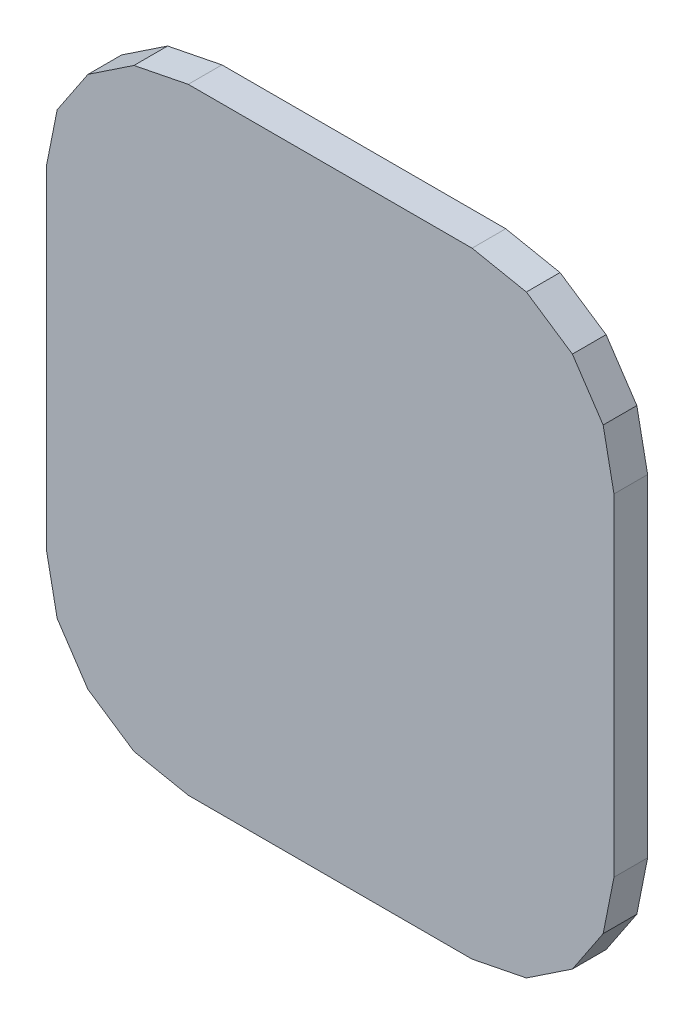
ISO-10303-21;
HEADER;
FILE_DESCRIPTION(('STEP AP214'),'2;1');
FILE_NAME('part.step','',(''),(''),'','','');
FILE_SCHEMA(('AUTOMOTIVE_DESIGN { 1 0 10303 214 1 1 1 1 }'));
ENDSEC;
DATA;
#1=APPLICATION_CONTEXT('core data for automotive mechanical design processes');
#2=APPLICATION_PROTOCOL_DEFINITION('international standard','automotive_design',2000,#1);
#3=PRODUCT_CONTEXT('',#1,'mechanical');
#4=PRODUCT('Part','Part','',(#3));
#5=PRODUCT_RELATED_PRODUCT_CATEGORY('part','',(#4));
#6=PRODUCT_DEFINITION_FORMATION('','',#4);
#7=PRODUCT_DEFINITION_CONTEXT('part definition',#1,'design');
#8=PRODUCT_DEFINITION('design','',#6,#7);
#9=PRODUCT_DEFINITION_SHAPE('','',#8);
#10=(LENGTH_UNIT() NAMED_UNIT(*) SI_UNIT(.MILLI.,.METRE.));
#11=(NAMED_UNIT(*) PLANE_ANGLE_UNIT() SI_UNIT($,.RADIAN.));
#12=(NAMED_UNIT(*) SI_UNIT($,.STERADIAN.) SOLID_ANGLE_UNIT());
#13=UNCERTAINTY_MEASURE_WITH_UNIT(LENGTH_MEASURE(1.E-05),#10,'distance_accuracy_value','');
#14=(GEOMETRIC_REPRESENTATION_CONTEXT(3) GLOBAL_UNCERTAINTY_ASSIGNED_CONTEXT((#13)) GLOBAL_UNIT_ASSIGNED_CONTEXT((#10,
#11,#12)) REPRESENTATION_CONTEXT('',''));
#15=CARTESIAN_POINT('',(0.,0.,0.));
#16=DIRECTION('',(0.,0.,1.));
#17=DIRECTION('',(1.,0.,0.));
#18=AXIS2_PLACEMENT_3D('',#15,#16,#17);
#19=CARTESIAN_POINT('',(97.865,-121.8,1.635));
#20=DIRECTION('',(0.,0.,-1.));
#21=DIRECTION('',(0.,-1.,0.));
#22=AXIS2_PLACEMENT_3D('',#19,#20,#21);
#23=PLANE('',#22);
#24=DIRECTION('',(0.980784640360412,-0.195093539701082,0.));
#25=VECTOR('',#24,1.);
#26=CARTESIAN_POINT('',(98.0125,-121.48,1.635));
#27=LINE('',#26,#25);
#28=CARTESIAN_POINT('',(98.0125,-121.48,1.635));
#29=VERTEX_POINT('',#28);
#30=CARTESIAN_POINT('',(98.068946,-121.491228,1.635));
#31=VERTEX_POINT('',#30);
#32=EDGE_CURVE('E25',#29,#31,#27,.T.);
#33=ORIENTED_EDGE('',*,*,#32,.F.);
#34=DIRECTION('',(1.,0.,0.));
#35=VECTOR('',#34,1.);
#36=CARTESIAN_POINT('',(97.7175,-121.48,1.635));
#37=LINE('',#36,#35);
#38=CARTESIAN_POINT('',(97.7175,-121.48,1.635));
#39=VERTEX_POINT('',#38);
#40=EDGE_CURVE('E413',#39,#29,#37,.T.);
#41=ORIENTED_EDGE('',*,*,#40,.F.);
#42=DIRECTION('',(0.980784640360412,0.195093539701082,0.));
#43=VECTOR('',#42,1.);
#44=CARTESIAN_POINT('',(97.661054,-121.491228,1.635));
#45=LINE('',#44,#43);
#46=CARTESIAN_POINT('',(97.661054,-121.491228,1.635));
#47=VERTEX_POINT('',#46);
#48=EDGE_CURVE('E290',#47,#39,#45,.T.);
#49=ORIENTED_EDGE('',*,*,#48,.F.);
#50=DIRECTION('',(0.831467077354216,0.555574026819144,0.));
#51=VECTOR('',#50,1.);
#52=CARTESIAN_POINT('',(97.613202,-121.523202,1.635));
#53=LINE('',#52,#51);
#54=CARTESIAN_POINT('',(97.613202,-121.523202,1.635));
#55=VERTEX_POINT('',#54);
#56=EDGE_CURVE('E291',#55,#47,#53,.T.);
#57=ORIENTED_EDGE('',*,*,#56,.F.);
#58=DIRECTION('',(0.555574026819144,0.831467077354216,0.));
#59=VECTOR('',#58,1.);
#60=CARTESIAN_POINT('',(97.581228,-121.571054,1.635));
#61=LINE('',#60,#59);
#62=CARTESIAN_POINT('',(97.581228,-121.571054,1.635));
#63=VERTEX_POINT('',#62);
#64=EDGE_CURVE('E319',#63,#55,#61,.T.);
#65=ORIENTED_EDGE('',*,*,#64,.F.);
#66=DIRECTION('',(0.195093539701082,0.980784640360412,0.));
#67=VECTOR('',#66,1.);
#68=CARTESIAN_POINT('',(97.57,-121.6275,1.635));
#69=LINE('',#68,#67);
#70=CARTESIAN_POINT('',(97.57,-121.6275,1.635));
#71=VERTEX_POINT('',#70);
#72=EDGE_CURVE('E241',#71,#63,#69,.T.);
#73=ORIENTED_EDGE('',*,*,#72,.F.);
#74=DIRECTION('',(0.,1.,0.));
#75=VECTOR('',#74,1.);
#76=CARTESIAN_POINT('',(97.57,-121.9725,1.635));
#77=LINE('',#76,#75);
#78=CARTESIAN_POINT('',(97.57,-121.9725,1.635));
#79=VERTEX_POINT('',#78);
#80=EDGE_CURVE('E277',#79,#71,#77,.T.);
#81=ORIENTED_EDGE('',*,*,#80,.F.);
#82=DIRECTION('',(-0.195093539701082,0.980784640360412,0.));
#83=VECTOR('',#82,1.);
#84=CARTESIAN_POINT('',(97.581228,-122.028946,1.635));
#85=LINE('',#84,#83);
#86=CARTESIAN_POINT('',(97.581228,-122.028946,1.635));
#87=VERTEX_POINT('',#86);
#88=EDGE_CURVE('E384',#87,#79,#85,.T.);
#89=ORIENTED_EDGE('',*,*,#88,.F.);
#90=DIRECTION('',(-0.555574026819144,0.831467077354216,0.));
#91=VECTOR('',#90,1.);
#92=CARTESIAN_POINT('',(97.613202,-122.076798,1.635));
#93=LINE('',#92,#91);
#94=CARTESIAN_POINT('',(97.613202,-122.076798,1.635));
#95=VERTEX_POINT('',#94);
#96=EDGE_CURVE('E271',#95,#87,#93,.T.);
#97=ORIENTED_EDGE('',*,*,#96,.F.);
#98=DIRECTION('',(-0.831467077354216,0.555574026819144,0.));
#99=VECTOR('',#98,1.);
#100=CARTESIAN_POINT('',(97.661054,-122.108772,1.635));
#101=LINE('',#100,#99);
#102=CARTESIAN_POINT('',(97.661054,-122.108772,1.635));
#103=VERTEX_POINT('',#102);
#104=EDGE_CURVE('E370',#103,#95,#101,.T.);
#105=ORIENTED_EDGE('',*,*,#104,.F.);
#106=DIRECTION('',(-0.980784640360412,0.195093539701082,0.));
#107=VECTOR('',#106,1.);
#108=CARTESIAN_POINT('',(97.7175,-122.12,1.635));
#109=LINE('',#108,#107);
#110=CARTESIAN_POINT('',(97.7175,-122.12,1.635));
#111=VERTEX_POINT('',#110);
#112=EDGE_CURVE('E354',#111,#103,#109,.T.);
#113=ORIENTED_EDGE('',*,*,#112,.F.);
#114=DIRECTION('',(-1.,0.,0.));
#115=VECTOR('',#114,1.);
#116=CARTESIAN_POINT('',(98.0125,-122.12,1.635));
#117=LINE('',#116,#115);
#118=CARTESIAN_POINT('',(98.0125,-122.12,1.635));
#119=VERTEX_POINT('',#118);
#120=EDGE_CURVE('E345',#119,#111,#117,.T.);
#121=ORIENTED_EDGE('',*,*,#120,.F.);
#122=DIRECTION('',(-0.980784640360412,-0.195093539701082,0.));
#123=VECTOR('',#122,1.);
#124=CARTESIAN_POINT('',(98.068946,-122.108772,1.635));
#125=LINE('',#124,#123);
#126=CARTESIAN_POINT('',(98.068946,-122.108772,1.635));
#127=VERTEX_POINT('',#126);
#128=EDGE_CURVE('E247',#127,#119,#125,.T.);
#129=ORIENTED_EDGE('',*,*,#128,.F.);
#130=DIRECTION('',(-0.831467077354216,-0.555574026819144,0.));
#131=VECTOR('',#130,1.);
#132=CARTESIAN_POINT('',(98.116798,-122.076798,1.635));
#133=LINE('',#132,#131);
#134=CARTESIAN_POINT('',(98.116798,-122.076798,1.635));
#135=VERTEX_POINT('',#134);
#136=EDGE_CURVE('E318',#135,#127,#133,.T.);
#137=ORIENTED_EDGE('',*,*,#136,.F.);
#138=DIRECTION('',(-0.555574026819144,-0.831467077354216,0.));
#139=VECTOR('',#138,1.);
#140=CARTESIAN_POINT('',(98.148772,-122.028946,1.635));
#141=LINE('',#140,#139);
#142=CARTESIAN_POINT('',(98.148772,-122.028946,1.635));
#143=VERTEX_POINT('',#142);
#144=EDGE_CURVE('E300',#143,#135,#141,.T.);
#145=ORIENTED_EDGE('',*,*,#144,.F.);
#146=DIRECTION('',(-0.195093539701082,-0.980784640360412,0.));
#147=VECTOR('',#146,1.);
#148=CARTESIAN_POINT('',(98.16,-121.9725,1.635));
#149=LINE('',#148,#147);
#150=CARTESIAN_POINT('',(98.16,-121.9725,1.635));
#151=VERTEX_POINT('',#150);
#152=EDGE_CURVE('E264',#151,#143,#149,.T.);
#153=ORIENTED_EDGE('',*,*,#152,.F.);
#154=DIRECTION('',(0.,-1.,0.));
#155=VECTOR('',#154,1.);
#156=CARTESIAN_POINT('',(98.16,-121.6275,1.635));
#157=LINE('',#156,#155);
#158=CARTESIAN_POINT('',(98.16,-121.6275,1.635));
#159=VERTEX_POINT('',#158);
#160=EDGE_CURVE('E210',#159,#151,#157,.T.);
#161=ORIENTED_EDGE('',*,*,#160,.F.);
#162=DIRECTION('',(0.195093539701082,-0.980784640360412,0.));
#163=VECTOR('',#162,1.);
#164=CARTESIAN_POINT('',(98.148772,-121.571054,1.635));
#165=LINE('',#164,#163);
#166=CARTESIAN_POINT('',(98.148772,-121.571054,1.635));
#167=VERTEX_POINT('',#166);
#168=EDGE_CURVE('E221',#167,#159,#165,.T.);
#169=ORIENTED_EDGE('',*,*,#168,.F.);
#170=DIRECTION('',(0.555574026818682,-0.831467077354524,0.));
#171=VECTOR('',#170,1.);
#172=CARTESIAN_POINT('',(98.116798,-121.523202,1.635));
#173=LINE('',#172,#171);
#174=CARTESIAN_POINT('',(98.116798,-121.523202,1.635));
#175=VERTEX_POINT('',#174);
#176=EDGE_CURVE('E224',#175,#167,#173,.T.);
#177=ORIENTED_EDGE('',*,*,#176,.F.);
#178=DIRECTION('',(0.831467077354524,-0.555574026818682,0.));
#179=VECTOR('',#178,1.);
#180=CARTESIAN_POINT('',(98.068946,-121.491228,1.635));
#181=LINE('',#180,#179);
#182=EDGE_CURVE('E471',#31,#175,#181,.T.);
#183=ORIENTED_EDGE('',*,*,#182,.F.);
#184=EDGE_LOOP('',(#33,#41,#49,#57,#65,#73,#81,#89,#97,#105,#113,#121,#129,#137,#145,#153,#161,
#169,#177,#183));
#185=FACE_BOUND('',#184,.T.);
#186=ADVANCED_FACE('F17',(#185),#23,.F.);
#187=CARTESIAN_POINT('',(97.865,-121.8,1.6));
#188=DIRECTION('',(0.,0.,-1.));
#189=DIRECTION('',(0.,-1.,0.));
#190=AXIS2_PLACEMENT_3D('',#187,#188,#189);
#191=PLANE('',#190);
#192=DIRECTION('',(0.831467077354524,-0.555574026818682,0.));
#193=VECTOR('',#192,1.);
#194=CARTESIAN_POINT('',(98.068946,-121.491228,1.6));
#195=LINE('',#194,#193);
#196=CARTESIAN_POINT('',(98.068946,-121.491228,1.6));
#197=VERTEX_POINT('',#196);
#198=CARTESIAN_POINT('',(98.116798,-121.523202,1.6));
#199=VERTEX_POINT('',#198);
#200=EDGE_CURVE('E216',#197,#199,#195,.T.);
#201=ORIENTED_EDGE('',*,*,#200,.T.);
#202=DIRECTION('',(0.555574026818682,-0.831467077354524,0.));
#203=VECTOR('',#202,1.);
#204=CARTESIAN_POINT('',(98.116798,-121.523202,1.6));
#205=LINE('',#204,#203);
#206=CARTESIAN_POINT('',(98.148772,-121.571054,1.6));
#207=VERTEX_POINT('',#206);
#208=EDGE_CURVE('E213',#199,#207,#205,.T.);
#209=ORIENTED_EDGE('',*,*,#208,.T.);
#210=DIRECTION('',(0.195093539701082,-0.980784640360412,0.));
#211=VECTOR('',#210,1.);
#212=CARTESIAN_POINT('',(98.148772,-121.571054,1.6));
#213=LINE('',#212,#211);
#214=CARTESIAN_POINT('',(98.16,-121.6275,1.6));
#215=VERTEX_POINT('',#214);
#216=EDGE_CURVE('E198',#207,#215,#213,.T.);
#217=ORIENTED_EDGE('',*,*,#216,.T.);
#218=DIRECTION('',(0.,-1.,0.));
#219=VECTOR('',#218,1.);
#220=CARTESIAN_POINT('',(98.16,-121.6275,1.6));
#221=LINE('',#220,#219);
#222=CARTESIAN_POINT('',(98.16,-121.9725,1.6));
#223=VERTEX_POINT('',#222);
#224=EDGE_CURVE('E255',#215,#223,#221,.T.);
#225=ORIENTED_EDGE('',*,*,#224,.T.);
#226=DIRECTION('',(-0.195093539701082,-0.980784640360412,0.));
#227=VECTOR('',#226,1.);
#228=CARTESIAN_POINT('',(98.16,-121.9725,1.6));
#229=LINE('',#228,#227);
#230=CARTESIAN_POINT('',(98.148772,-122.028946,1.6));
#231=VERTEX_POINT('',#230);
#232=EDGE_CURVE('E263',#223,#231,#229,.T.);
#233=ORIENTED_EDGE('',*,*,#232,.T.);
#234=DIRECTION('',(-0.555574026819144,-0.831467077354216,0.));
#235=VECTOR('',#234,1.);
#236=CARTESIAN_POINT('',(98.148772,-122.028946,1.6));
#237=LINE('',#236,#235);
#238=CARTESIAN_POINT('',(98.116798,-122.076798,1.6));
#239=VERTEX_POINT('',#238);
#240=EDGE_CURVE('E311',#231,#239,#237,.T.);
#241=ORIENTED_EDGE('',*,*,#240,.T.);
#242=DIRECTION('',(-0.831467077354216,-0.555574026819144,0.));
#243=VECTOR('',#242,1.);
#244=CARTESIAN_POINT('',(98.116798,-122.076798,1.6));
#245=LINE('',#244,#243);
#246=CARTESIAN_POINT('',(98.068946,-122.108772,1.6));
#247=VERTEX_POINT('',#246);
#248=EDGE_CURVE('E234',#239,#247,#245,.T.);
#249=ORIENTED_EDGE('',*,*,#248,.T.);
#250=DIRECTION('',(-0.980784640360412,-0.195093539701082,0.));
#251=VECTOR('',#250,1.);
#252=CARTESIAN_POINT('',(98.068946,-122.108772,1.6));
#253=LINE('',#252,#251);
#254=CARTESIAN_POINT('',(98.0125,-122.12,1.6));
#255=VERTEX_POINT('',#254);
#256=EDGE_CURVE('E341',#247,#255,#253,.T.);
#257=ORIENTED_EDGE('',*,*,#256,.T.);
#258=DIRECTION('',(-1.,0.,0.));
#259=VECTOR('',#258,1.);
#260=CARTESIAN_POINT('',(98.0125,-122.12,1.6));
#261=LINE('',#260,#259);
#262=CARTESIAN_POINT('',(97.7175,-122.12,1.6));
#263=VERTEX_POINT('',#262);
#264=EDGE_CURVE('E353',#255,#263,#261,.T.);
#265=ORIENTED_EDGE('',*,*,#264,.T.);
#266=DIRECTION('',(-0.980784640360412,0.195093539701082,0.));
#267=VECTOR('',#266,1.);
#268=CARTESIAN_POINT('',(97.7175,-122.12,1.6));
#269=LINE('',#268,#267);
#270=CARTESIAN_POINT('',(97.661054,-122.108772,1.6));
#271=VERTEX_POINT('',#270);
#272=EDGE_CURVE('E366',#263,#271,#269,.T.);
#273=ORIENTED_EDGE('',*,*,#272,.T.);
#274=DIRECTION('',(-0.831467077354216,0.555574026819144,0.));
#275=VECTOR('',#274,1.);
#276=CARTESIAN_POINT('',(97.661054,-122.108772,1.6));
#277=LINE('',#276,#275);
#278=CARTESIAN_POINT('',(97.613202,-122.076798,1.6));
#279=VERTEX_POINT('',#278);
#280=EDGE_CURVE('E334',#271,#279,#277,.T.);
#281=ORIENTED_EDGE('',*,*,#280,.T.);
#282=DIRECTION('',(-0.555574026819144,0.831467077354216,0.));
#283=VECTOR('',#282,1.);
#284=CARTESIAN_POINT('',(97.613202,-122.076798,1.6));
#285=LINE('',#284,#283);
#286=CARTESIAN_POINT('',(97.581228,-122.028946,1.6));
#287=VERTEX_POINT('',#286);
#288=EDGE_CURVE('E270',#279,#287,#285,.T.);
#289=ORIENTED_EDGE('',*,*,#288,.T.);
#290=DIRECTION('',(-0.195093539701082,0.980784640360412,0.));
#291=VECTOR('',#290,1.);
#292=CARTESIAN_POINT('',(97.581228,-122.028946,1.6));
#293=LINE('',#292,#291);
#294=CARTESIAN_POINT('',(97.57,-121.9725,1.6));
#295=VERTEX_POINT('',#294);
#296=EDGE_CURVE('E273',#287,#295,#293,.T.);
#297=ORIENTED_EDGE('',*,*,#296,.T.);
#298=DIRECTION('',(0.,1.,0.));
#299=VECTOR('',#298,1.);
#300=CARTESIAN_POINT('',(97.57,-121.9725,1.6));
#301=LINE('',#300,#299);
#302=CARTESIAN_POINT('',(97.57,-121.6275,1.6));
#303=VERTEX_POINT('',#302);
#304=EDGE_CURVE('E242',#295,#303,#301,.T.);
#305=ORIENTED_EDGE('',*,*,#304,.T.);
#306=DIRECTION('',(0.195093539701082,0.980784640360412,0.));
#307=VECTOR('',#306,1.);
#308=CARTESIAN_POINT('',(97.57,-121.6275,1.6));
#309=LINE('',#308,#307);
#310=CARTESIAN_POINT('',(97.581228,-121.571054,1.6));
#311=VERTEX_POINT('',#310);
#312=EDGE_CURVE('E240',#303,#311,#309,.T.);
#313=ORIENTED_EDGE('',*,*,#312,.T.);
#314=DIRECTION('',(0.555574026819144,0.831467077354216,0.));
#315=VECTOR('',#314,1.);
#316=CARTESIAN_POINT('',(97.581228,-121.571054,1.6));
#317=LINE('',#316,#315);
#318=CARTESIAN_POINT('',(97.613202,-121.523202,1.6));
#319=VERTEX_POINT('',#318);
#320=EDGE_CURVE('E296',#311,#319,#317,.T.);
#321=ORIENTED_EDGE('',*,*,#320,.T.);
#322=DIRECTION('',(0.831467077354216,0.555574026819144,0.));
#323=VECTOR('',#322,1.);
#324=CARTESIAN_POINT('',(97.613202,-121.523202,1.6));
#325=LINE('',#324,#323);
#326=CARTESIAN_POINT('',(97.661054,-121.491228,1.6));
#327=VERTEX_POINT('',#326);
#328=EDGE_CURVE('E403',#319,#327,#325,.T.);
#329=ORIENTED_EDGE('',*,*,#328,.T.);
#330=DIRECTION('',(0.980784640360412,0.195093539701082,0.));
#331=VECTOR('',#330,1.);
#332=CARTESIAN_POINT('',(97.661054,-121.491228,1.6));
#333=LINE('',#332,#331);
#334=CARTESIAN_POINT('',(97.7175,-121.48,1.6));
#335=VERTEX_POINT('',#334);
#336=EDGE_CURVE('E289',#327,#335,#333,.T.);
#337=ORIENTED_EDGE('',*,*,#336,.T.);
#338=DIRECTION('',(1.,0.,0.));
#339=VECTOR('',#338,1.);
#340=CARTESIAN_POINT('',(97.7175,-121.48,1.6));
#341=LINE('',#340,#339);
#342=CARTESIAN_POINT('',(98.0125,-121.48,1.6));
#343=VERTEX_POINT('',#342);
#344=EDGE_CURVE('E359',#335,#343,#341,.T.);
#345=ORIENTED_EDGE('',*,*,#344,.T.);
#346=DIRECTION('',(0.980784640360412,-0.195093539701082,0.));
#347=VECTOR('',#346,1.);
#348=CARTESIAN_POINT('',(98.0125,-121.48,1.6));
#349=LINE('',#348,#347);
#350=EDGE_CURVE('E11',#343,#197,#349,.T.);
#351=ORIENTED_EDGE('',*,*,#350,.T.);
#352=EDGE_LOOP('',(#201,#209,#217,#225,#233,#241,#249,#257,#265,#273,#281,#289,#297,#305,#313,
#321,#329,#337,#345,#351));
#353=FACE_BOUND('',#352,.T.);
#354=ADVANCED_FACE('F214',(#353),#191,.T.);
#355=CARTESIAN_POINT('',(98.0125,-121.48,1.6));
#356=DIRECTION('',(0.195093539701082,0.980784640360412,0.));
#357=DIRECTION('',(0.,0.,-1.));
#358=AXIS2_PLACEMENT_3D('',#355,#356,#357);
#359=PLANE('',#358);
#360=DIRECTION('',(0.,0.,1.));
#361=VECTOR('',#360,1.);
#362=CARTESIAN_POINT('',(98.0125,-121.48,1.6));
#363=LINE('',#362,#361);
#364=EDGE_CURVE('E362',#343,#29,#363,.T.);
#365=ORIENTED_EDGE('',*,*,#364,.T.);
#366=ORIENTED_EDGE('',*,*,#32,.T.);
#367=DIRECTION('',(0.,0.,1.));
#368=VECTOR('',#367,1.);
#369=CARTESIAN_POINT('',(98.068946,-121.491228,1.6));
#370=LINE('',#369,#368);
#371=EDGE_CURVE('E478',#197,#31,#370,.T.);
#372=ORIENTED_EDGE('',*,*,#371,.F.);
#373=ORIENTED_EDGE('',*,*,#350,.F.);
#374=EDGE_LOOP('',(#365,#366,#372,#373));
#375=FACE_BOUND('',#374,.T.);
#376=ADVANCED_FACE('F420',(#375),#359,.T.);
#377=CARTESIAN_POINT('',(97.7175,-121.48,1.6));
#378=DIRECTION('',(0.,1.,0.));
#379=DIRECTION('',(1.,0.,0.));
#380=AXIS2_PLACEMENT_3D('',#377,#378,#379);
#381=PLANE('',#380);
#382=DIRECTION('',(0.,0.,1.));
#383=VECTOR('',#382,1.);
#384=CARTESIAN_POINT('',(97.7175,-121.48,1.6));
#385=LINE('',#384,#383);
#386=EDGE_CURVE('E285',#335,#39,#385,.T.);
#387=ORIENTED_EDGE('',*,*,#386,.T.);
#388=ORIENTED_EDGE('',*,*,#40,.T.);
#389=ORIENTED_EDGE('',*,*,#364,.F.);
#390=ORIENTED_EDGE('',*,*,#344,.F.);
#391=EDGE_LOOP('',(#387,#388,#389,#390));
#392=FACE_BOUND('',#391,.T.);
#393=ADVANCED_FACE('F422',(#392),#381,.T.);
#394=CARTESIAN_POINT('',(97.661054,-121.491228,1.6));
#395=DIRECTION('',(-0.195093539701082,0.980784640360412,0.));
#396=DIRECTION('',(0.,0.,1.));
#397=AXIS2_PLACEMENT_3D('',#394,#395,#396);
#398=PLANE('',#397);
#399=DIRECTION('',(0.,0.,1.));
#400=VECTOR('',#399,1.);
#401=CARTESIAN_POINT('',(97.661054,-121.491228,1.6));
#402=LINE('',#401,#400);
#403=EDGE_CURVE('E295',#327,#47,#402,.T.);
#404=ORIENTED_EDGE('',*,*,#403,.T.);
#405=ORIENTED_EDGE('',*,*,#48,.T.);
#406=ORIENTED_EDGE('',*,*,#386,.F.);
#407=ORIENTED_EDGE('',*,*,#336,.F.);
#408=EDGE_LOOP('',(#404,#405,#406,#407));
#409=FACE_BOUND('',#408,.T.);
#410=ADVANCED_FACE('F426',(#409),#398,.T.);
#411=CARTESIAN_POINT('',(97.613202,-121.523202,1.6));
#412=DIRECTION('',(-0.555574026819144,0.831467077354216,0.));
#413=DIRECTION('',(0.,0.,1.));
#414=AXIS2_PLACEMENT_3D('',#411,#412,#413);
#415=PLANE('',#414);
#416=DIRECTION('',(0.,0.,1.));
#417=VECTOR('',#416,1.);
#418=CARTESIAN_POINT('',(97.613202,-121.523202,1.6));
#419=LINE('',#418,#417);
#420=EDGE_CURVE('E323',#319,#55,#419,.T.);
#421=ORIENTED_EDGE('',*,*,#420,.T.);
#422=ORIENTED_EDGE('',*,*,#56,.T.);
#423=ORIENTED_EDGE('',*,*,#403,.F.);
#424=ORIENTED_EDGE('',*,*,#328,.F.);
#425=EDGE_LOOP('',(#421,#422,#423,#424));
#426=FACE_BOUND('',#425,.T.);
#427=ADVANCED_FACE('F428',(#426),#415,.T.);
#428=CARTESIAN_POINT('',(97.581228,-121.571054,1.6));
#429=DIRECTION('',(-0.831467077354216,0.555574026819144,0.));
#430=DIRECTION('',(0.,0.,1.));
#431=AXIS2_PLACEMENT_3D('',#428,#429,#430);
#432=PLANE('',#431);
#433=DIRECTION('',(0.,0.,1.));
#434=VECTOR('',#433,1.);
#435=CARTESIAN_POINT('',(97.581228,-121.571054,1.6));
#436=LINE('',#435,#434);
#437=EDGE_CURVE('E236',#311,#63,#436,.T.);
#438=ORIENTED_EDGE('',*,*,#437,.T.);
#439=ORIENTED_EDGE('',*,*,#64,.T.);
#440=ORIENTED_EDGE('',*,*,#420,.F.);
#441=ORIENTED_EDGE('',*,*,#320,.F.);
#442=EDGE_LOOP('',(#438,#439,#440,#441));
#443=FACE_BOUND('',#442,.T.);
#444=ADVANCED_FACE('F431',(#443),#432,.T.);
#445=CARTESIAN_POINT('',(97.57,-121.6275,1.6));
#446=DIRECTION('',(-0.980784640360412,0.195093539701082,0.));
#447=DIRECTION('',(0.,0.,1.));
#448=AXIS2_PLACEMENT_3D('',#445,#446,#447);
#449=PLANE('',#448);
#450=DIRECTION('',(0.,0.,1.));
#451=VECTOR('',#450,1.);
#452=CARTESIAN_POINT('',(97.57,-121.6275,1.6));
#453=LINE('',#452,#451);
#454=EDGE_CURVE('E246',#303,#71,#453,.T.);
#455=ORIENTED_EDGE('',*,*,#454,.T.);
#456=ORIENTED_EDGE('',*,*,#72,.T.);
#457=ORIENTED_EDGE('',*,*,#437,.F.);
#458=ORIENTED_EDGE('',*,*,#312,.F.);
#459=EDGE_LOOP('',(#455,#456,#457,#458));
#460=FACE_BOUND('',#459,.T.);
#461=ADVANCED_FACE('F435',(#460),#449,.T.);
#462=CARTESIAN_POINT('',(97.57,-121.9725,1.6));
#463=DIRECTION('',(-1.,0.,0.));
#464=DIRECTION('',(0.,0.,1.));
#465=AXIS2_PLACEMENT_3D('',#462,#463,#464);
#466=PLANE('',#465);
#467=DIRECTION('',(0.,0.,1.));
#468=VECTOR('',#467,1.);
#469=CARTESIAN_POINT('',(97.57,-121.9725,1.6));
#470=LINE('',#469,#468);
#471=EDGE_CURVE('E278',#295,#79,#470,.T.);
#472=ORIENTED_EDGE('',*,*,#471,.T.);
#473=ORIENTED_EDGE('',*,*,#80,.T.);
#474=ORIENTED_EDGE('',*,*,#454,.F.);
#475=ORIENTED_EDGE('',*,*,#304,.F.);
#476=EDGE_LOOP('',(#472,#473,#474,#475));
#477=FACE_BOUND('',#476,.T.);
#478=ADVANCED_FACE('F437',(#477),#466,.T.);
#479=CARTESIAN_POINT('',(97.581228,-122.028946,1.6));
#480=DIRECTION('',(-0.980784640360412,-0.195093539701082,0.));
#481=DIRECTION('',(-0.195093539701082,0.980784640360412,0.));
#482=AXIS2_PLACEMENT_3D('',#479,#480,#481);
#483=PLANE('',#482);
#484=DIRECTION('',(0.,0.,1.));
#485=VECTOR('',#484,1.);
#486=CARTESIAN_POINT('',(97.581228,-122.028946,1.6));
#487=LINE('',#486,#485);
#488=EDGE_CURVE('E267',#287,#87,#487,.T.);
#489=ORIENTED_EDGE('',*,*,#488,.T.);
#490=ORIENTED_EDGE('',*,*,#88,.T.);
#491=ORIENTED_EDGE('',*,*,#471,.F.);
#492=ORIENTED_EDGE('',*,*,#296,.F.);
#493=EDGE_LOOP('',(#489,#490,#491,#492));
#494=FACE_BOUND('',#493,.T.);
#495=ADVANCED_FACE('F440',(#494),#483,.T.);
#496=CARTESIAN_POINT('',(97.613202,-122.076798,1.6));
#497=DIRECTION('',(-0.831467077354216,-0.555574026819144,0.));
#498=DIRECTION('',(-0.555574026819144,0.831467077354216,0.));
#499=AXIS2_PLACEMENT_3D('',#496,#497,#498);
#500=PLANE('',#499);
#501=DIRECTION('',(0.,0.,1.));
#502=VECTOR('',#501,1.);
#503=CARTESIAN_POINT('',(97.613202,-122.076798,1.6));
#504=LINE('',#503,#502);
#505=EDGE_CURVE('E374',#279,#95,#504,.T.);
#506=ORIENTED_EDGE('',*,*,#505,.T.);
#507=ORIENTED_EDGE('',*,*,#96,.T.);
#508=ORIENTED_EDGE('',*,*,#488,.F.);
#509=ORIENTED_EDGE('',*,*,#288,.F.);
#510=EDGE_LOOP('',(#506,#507,#508,#509));
#511=FACE_BOUND('',#510,.T.);
#512=ADVANCED_FACE('F444',(#511),#500,.T.);
#513=CARTESIAN_POINT('',(97.661054,-122.108772,1.6));
#514=DIRECTION('',(-0.555574026819144,-0.831467077354216,0.));
#515=DIRECTION('',(-0.831467077354216,0.555574026819144,0.));
#516=AXIS2_PLACEMENT_3D('',#513,#514,#515);
#517=PLANE('',#516);
#518=DIRECTION('',(0.,0.,1.));
#519=VECTOR('',#518,1.);
#520=CARTESIAN_POINT('',(97.661054,-122.108772,1.6));
#521=LINE('',#520,#519);
#522=EDGE_CURVE('E358',#271,#103,#521,.T.);
#523=ORIENTED_EDGE('',*,*,#522,.T.);
#524=ORIENTED_EDGE('',*,*,#104,.T.);
#525=ORIENTED_EDGE('',*,*,#505,.F.);
#526=ORIENTED_EDGE('',*,*,#280,.F.);
#527=EDGE_LOOP('',(#523,#524,#525,#526));
#528=FACE_BOUND('',#527,.T.);
#529=ADVANCED_FACE('F446',(#528),#517,.T.);
#530=CARTESIAN_POINT('',(97.7175,-122.12,1.6));
#531=DIRECTION('',(-0.195093539701082,-0.980784640360412,0.));
#532=DIRECTION('',(-0.980784640360412,0.195093539701082,0.));
#533=AXIS2_PLACEMENT_3D('',#530,#531,#532);
#534=PLANE('',#533);
#535=DIRECTION('',(0.,0.,1.));
#536=VECTOR('',#535,1.);
#537=CARTESIAN_POINT('',(97.7175,-122.12,1.6));
#538=LINE('',#537,#536);
#539=EDGE_CURVE('E349',#263,#111,#538,.T.);
#540=ORIENTED_EDGE('',*,*,#539,.T.);
#541=ORIENTED_EDGE('',*,*,#112,.T.);
#542=ORIENTED_EDGE('',*,*,#522,.F.);
#543=ORIENTED_EDGE('',*,*,#272,.F.);
#544=EDGE_LOOP('',(#540,#541,#542,#543));
#545=FACE_BOUND('',#544,.T.);
#546=ADVANCED_FACE('F449',(#545),#534,.T.);
#547=CARTESIAN_POINT('',(98.0125,-122.12,1.6));
#548=DIRECTION('',(0.,-1.,0.));
#549=DIRECTION('',(0.,0.,-1.));
#550=AXIS2_PLACEMENT_3D('',#547,#548,#549);
#551=PLANE('',#550);
#552=DIRECTION('',(0.,0.,1.));
#553=VECTOR('',#552,1.);
#554=CARTESIAN_POINT('',(98.0125,-122.12,1.6));
#555=LINE('',#554,#553);
#556=EDGE_CURVE('E251',#255,#119,#555,.T.);
#557=ORIENTED_EDGE('',*,*,#556,.T.);
#558=ORIENTED_EDGE('',*,*,#120,.T.);
#559=ORIENTED_EDGE('',*,*,#539,.F.);
#560=ORIENTED_EDGE('',*,*,#264,.F.);
#561=EDGE_LOOP('',(#557,#558,#559,#560));
#562=FACE_BOUND('',#561,.T.);
#563=ADVANCED_FACE('F453',(#562),#551,.T.);
#564=CARTESIAN_POINT('',(98.068946,-122.108772,1.6));
#565=DIRECTION('',(0.195093539701082,-0.980784640360412,0.));
#566=DIRECTION('',(0.,0.,-1.));
#567=AXIS2_PLACEMENT_3D('',#564,#565,#566);
#568=PLANE('',#567);
#569=DIRECTION('',(0.,0.,1.));
#570=VECTOR('',#569,1.);
#571=CARTESIAN_POINT('',(98.068946,-122.108772,1.6));
#572=LINE('',#571,#570);
#573=EDGE_CURVE('E327',#247,#127,#572,.T.);
#574=ORIENTED_EDGE('',*,*,#573,.T.);
#575=ORIENTED_EDGE('',*,*,#128,.T.);
#576=ORIENTED_EDGE('',*,*,#556,.F.);
#577=ORIENTED_EDGE('',*,*,#256,.F.);
#578=EDGE_LOOP('',(#574,#575,#576,#577));
#579=FACE_BOUND('',#578,.T.);
#580=ADVANCED_FACE('F456',(#579),#568,.T.);
#581=CARTESIAN_POINT('',(98.116798,-122.076798,1.6));
#582=DIRECTION('',(0.555574026819144,-0.831467077354216,0.));
#583=DIRECTION('',(0.,0.,-1.));
#584=AXIS2_PLACEMENT_3D('',#581,#582,#583);
#585=PLANE('',#584);
#586=DIRECTION('',(0.,0.,1.));
#587=VECTOR('',#586,1.);
#588=CARTESIAN_POINT('',(98.116798,-122.076798,1.6));
#589=LINE('',#588,#587);
#590=EDGE_CURVE('E304',#239,#135,#589,.T.);
#591=ORIENTED_EDGE('',*,*,#590,.T.);
#592=ORIENTED_EDGE('',*,*,#136,.T.);
#593=ORIENTED_EDGE('',*,*,#573,.F.);
#594=ORIENTED_EDGE('',*,*,#248,.F.);
#595=EDGE_LOOP('',(#591,#592,#593,#594));
#596=FACE_BOUND('',#595,.T.);
#597=ADVANCED_FACE('F460',(#596),#585,.T.);
#598=CARTESIAN_POINT('',(98.148772,-122.028946,1.6));
#599=DIRECTION('',(0.831467077354216,-0.555574026819144,0.));
#600=DIRECTION('',(0.,0.,-1.));
#601=AXIS2_PLACEMENT_3D('',#598,#599,#600);
#602=PLANE('',#601);
#603=DIRECTION('',(0.,0.,1.));
#604=VECTOR('',#603,1.);
#605=CARTESIAN_POINT('',(98.148772,-122.028946,1.6));
#606=LINE('',#605,#604);
#607=EDGE_CURVE('E259',#231,#143,#606,.T.);
#608=ORIENTED_EDGE('',*,*,#607,.T.);
#609=ORIENTED_EDGE('',*,*,#144,.T.);
#610=ORIENTED_EDGE('',*,*,#590,.F.);
#611=ORIENTED_EDGE('',*,*,#240,.F.);
#612=EDGE_LOOP('',(#608,#609,#610,#611));
#613=FACE_BOUND('',#612,.T.);
#614=ADVANCED_FACE('F464',(#613),#602,.T.);
#615=CARTESIAN_POINT('',(98.16,-121.9725,1.6));
#616=DIRECTION('',(0.980784640360412,-0.195093539701082,0.));
#617=DIRECTION('',(0.,0.,-1.));
#618=AXIS2_PLACEMENT_3D('',#615,#616,#617);
#619=PLANE('',#618);
#620=DIRECTION('',(0.,0.,1.));
#621=VECTOR('',#620,1.);
#622=CARTESIAN_POINT('',(98.16,-121.9725,1.6));
#623=LINE('',#622,#621);
#624=EDGE_CURVE('E252',#223,#151,#623,.T.);
#625=ORIENTED_EDGE('',*,*,#624,.T.);
#626=ORIENTED_EDGE('',*,*,#152,.T.);
#627=ORIENTED_EDGE('',*,*,#607,.F.);
#628=ORIENTED_EDGE('',*,*,#232,.F.);
#629=EDGE_LOOP('',(#625,#626,#627,#628));
#630=FACE_BOUND('',#629,.T.);
#631=ADVANCED_FACE('F466',(#630),#619,.T.);
#632=CARTESIAN_POINT('',(98.16,-121.6275,1.6));
#633=DIRECTION('',(1.,0.,0.));
#634=DIRECTION('',(0.,1.,0.));
#635=AXIS2_PLACEMENT_3D('',#632,#633,#634);
#636=PLANE('',#635);
#637=DIRECTION('',(0.,0.,1.));
#638=VECTOR('',#637,1.);
#639=CARTESIAN_POINT('',(98.16,-121.6275,1.6));
#640=LINE('',#639,#638);
#641=EDGE_CURVE('E206',#215,#159,#640,.T.);
#642=ORIENTED_EDGE('',*,*,#641,.T.);
#643=ORIENTED_EDGE('',*,*,#160,.T.);
#644=ORIENTED_EDGE('',*,*,#624,.F.);
#645=ORIENTED_EDGE('',*,*,#224,.F.);
#646=EDGE_LOOP('',(#642,#643,#644,#645));
#647=FACE_BOUND('',#646,.T.);
#648=ADVANCED_FACE('F469',(#647),#636,.T.);
#649=CARTESIAN_POINT('',(98.148772,-121.571054,1.6));
#650=DIRECTION('',(0.980784640360412,0.195093539701082,0.));
#651=DIRECTION('',(0.,0.,-1.));
#652=AXIS2_PLACEMENT_3D('',#649,#650,#651);
#653=PLANE('',#652);
#654=DIRECTION('',(0.,0.,1.));
#655=VECTOR('',#654,1.);
#656=CARTESIAN_POINT('',(98.148772,-121.571054,1.6));
#657=LINE('',#656,#655);
#658=EDGE_CURVE('E203',#207,#167,#657,.T.);
#659=ORIENTED_EDGE('',*,*,#658,.T.);
#660=ORIENTED_EDGE('',*,*,#168,.T.);
#661=ORIENTED_EDGE('',*,*,#641,.F.);
#662=ORIENTED_EDGE('',*,*,#216,.F.);
#663=EDGE_LOOP('',(#659,#660,#661,#662));
#664=FACE_BOUND('',#663,.T.);
#665=ADVANCED_FACE('F200',(#664),#653,.T.);
#666=CARTESIAN_POINT('',(98.116798,-121.523202,1.6));
#667=DIRECTION('',(0.831467077354524,0.555574026818682,0.));
#668=DIRECTION('',(0.,0.,-1.));
#669=AXIS2_PLACEMENT_3D('',#666,#667,#668);
#670=PLANE('',#669);
#671=DIRECTION('',(0.,0.,1.));
#672=VECTOR('',#671,1.);
#673=CARTESIAN_POINT('',(98.116798,-121.523202,1.6));
#674=LINE('',#673,#672);
#675=EDGE_CURVE('E473',#199,#175,#674,.T.);
#676=ORIENTED_EDGE('',*,*,#675,.T.);
#677=ORIENTED_EDGE('',*,*,#176,.T.);
#678=ORIENTED_EDGE('',*,*,#658,.F.);
#679=ORIENTED_EDGE('',*,*,#208,.F.);
#680=EDGE_LOOP('',(#676,#677,#678,#679));
#681=FACE_BOUND('',#680,.T.);
#682=ADVANCED_FACE('F223',(#681),#670,.T.);
#683=CARTESIAN_POINT('',(98.068946,-121.491228,1.6));
#684=DIRECTION('',(0.555574026818682,0.831467077354524,0.));
#685=DIRECTION('',(0.,0.,-1.));
#686=AXIS2_PLACEMENT_3D('',#683,#684,#685);
#687=PLANE('',#686);
#688=ORIENTED_EDGE('',*,*,#371,.T.);
#689=ORIENTED_EDGE('',*,*,#182,.T.);
#690=ORIENTED_EDGE('',*,*,#675,.F.);
#691=ORIENTED_EDGE('',*,*,#200,.F.);
#692=EDGE_LOOP('',(#688,#689,#690,#691));
#693=FACE_BOUND('',#692,.T.);
#694=ADVANCED_FACE('F477',(#693),#687,.T.);
#695=CLOSED_SHELL('',(#186,#354,#376,#393,#410,#427,#444,#461,#478,#495,#512,#529,#546,#563,
#580,#597,#614,#631,#648,#665,#682,#694));
#696=MANIFOLD_SOLID_BREP('B1',#695);
#697=ADVANCED_BREP_SHAPE_REPRESENTATION('',(#18,#696),#14);
#698=SHAPE_DEFINITION_REPRESENTATION(#9,#697);
ENDSEC;
END-ISO-10303-21;
